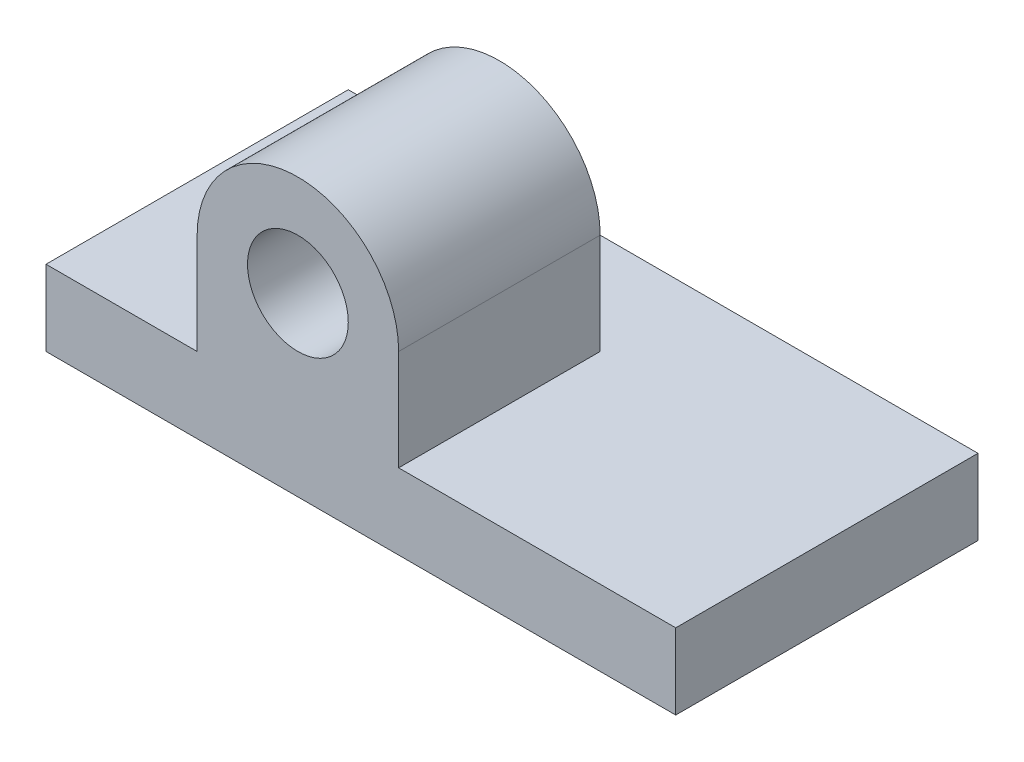
ISO-10303-21;
HEADER;
FILE_DESCRIPTION(('STEP AP214'),'2;1');
FILE_NAME('part.step','',(''),(''),'','','');
FILE_SCHEMA(('AUTOMOTIVE_DESIGN { 1 0 10303 214 1 1 1 1 }'));
ENDSEC;
DATA;
#1=APPLICATION_CONTEXT('core data for automotive mechanical design processes');
#2=APPLICATION_PROTOCOL_DEFINITION('international standard','automotive_design',2000,#1);
#3=PRODUCT_CONTEXT('',#1,'mechanical');
#4=PRODUCT('Part','Part','',(#3));
#5=PRODUCT_RELATED_PRODUCT_CATEGORY('part','',(#4));
#6=PRODUCT_DEFINITION_FORMATION('','',#4);
#7=PRODUCT_DEFINITION_CONTEXT('part definition',#1,'design');
#8=PRODUCT_DEFINITION('design','',#6,#7);
#9=PRODUCT_DEFINITION_SHAPE('','',#8);
#10=(LENGTH_UNIT() NAMED_UNIT(*) SI_UNIT(.MILLI.,.METRE.));
#11=(NAMED_UNIT(*) PLANE_ANGLE_UNIT() SI_UNIT($,.RADIAN.));
#12=(NAMED_UNIT(*) SI_UNIT($,.STERADIAN.) SOLID_ANGLE_UNIT());
#13=UNCERTAINTY_MEASURE_WITH_UNIT(LENGTH_MEASURE(1.E-05),#10,'distance_accuracy_value','');
#14=(GEOMETRIC_REPRESENTATION_CONTEXT(3) GLOBAL_UNCERTAINTY_ASSIGNED_CONTEXT((#13)) GLOBAL_UNIT_ASSIGNED_CONTEXT((#10,
#11,#12)) REPRESENTATION_CONTEXT('',''));
#15=CARTESIAN_POINT('',(0.,0.,0.));
#16=DIRECTION('',(0.,0.,1.));
#17=DIRECTION('',(1.,0.,0.));
#18=AXIS2_PLACEMENT_3D('',#15,#16,#17);
#19=CARTESIAN_POINT('',(30.,35.,-60.));
#20=DIRECTION('',(-1.,0.,0.));
#21=DIRECTION('',(0.,-1.,0.));
#22=AXIS2_PLACEMENT_3D('',#19,#20,#21);
#23=PLANE('',#22);
#24=DIRECTION('',(0.,0.,1.));
#25=VECTOR('',#24,1.);
#26=CARTESIAN_POINT('',(30.,35.,-60.));
#27=LINE('',#26,#25);
#28=CARTESIAN_POINT('',(30.,35.,-40.));
#29=VERTEX_POINT('',#28);
#30=CARTESIAN_POINT('',(30.,35.,0.));
#31=VERTEX_POINT('',#30);
#32=EDGE_CURVE('E143',#29,#31,#27,.T.);
#33=ORIENTED_EDGE('',*,*,#32,.F.);
#34=DIRECTION('',(0.,-1.,0.));
#35=VECTOR('',#34,1.);
#36=CARTESIAN_POINT('',(30.,35.,-40.));
#37=LINE('',#36,#35);
#38=CARTESIAN_POINT('',(30.,15.,-40.));
#39=VERTEX_POINT('',#38);
#40=EDGE_CURVE('E219',#29,#39,#37,.T.);
#41=ORIENTED_EDGE('',*,*,#40,.T.);
#42=DIRECTION('',(0.,0.,1.));
#43=VECTOR('',#42,1.);
#44=CARTESIAN_POINT('',(30.,15.,-60.));
#45=LINE('',#44,#43);
#46=CARTESIAN_POINT('',(30.,15.,0.));
#47=VERTEX_POINT('',#46);
#48=EDGE_CURVE('E54',#39,#47,#45,.T.);
#49=ORIENTED_EDGE('',*,*,#48,.T.);
#50=DIRECTION('',(0.,-1.,0.));
#51=VECTOR('',#50,1.);
#52=CARTESIAN_POINT('',(30.,35.,0.));
#53=LINE('',#52,#51);
#54=EDGE_CURVE('E184',#31,#47,#53,.T.);
#55=ORIENTED_EDGE('',*,*,#54,.F.);
#56=EDGE_LOOP('',(#33,#41,#49,#55));
#57=FACE_BOUND('',#56,.T.);
#58=ADVANCED_FACE('F44',(#57),#23,.T.);
#59=CARTESIAN_POINT('',(50.,35.,-60.));
#60=DIRECTION('',(0.,0.,1.));
#61=DIRECTION('',(1.,0.,0.));
#62=AXIS2_PLACEMENT_3D('',#59,#60,#61);
#63=CYLINDRICAL_SURFACE('',#62,20.);
#64=DIRECTION('',(0.,0.,1.));
#65=VECTOR('',#64,1.);
#66=CARTESIAN_POINT('',(70.,35.,-60.));
#67=LINE('',#66,#65);
#68=CARTESIAN_POINT('',(70.,35.,-40.));
#69=VERTEX_POINT('',#68);
#70=CARTESIAN_POINT('',(70.,35.,0.));
#71=VERTEX_POINT('',#70);
#72=EDGE_CURVE('E137',#69,#71,#67,.T.);
#73=ORIENTED_EDGE('',*,*,#72,.F.);
#74=CARTESIAN_POINT('',(50.,35.,-40.));
#75=DIRECTION('',(0.,0.,-1.));
#76=DIRECTION('',(-1.,0.,0.));
#77=AXIS2_PLACEMENT_3D('',#74,#75,#76);
#78=CIRCLE('',#77,20.);
#79=EDGE_CURVE('E61',#69,#29,#78,.F.);
#80=ORIENTED_EDGE('',*,*,#79,.T.);
#81=ORIENTED_EDGE('',*,*,#32,.T.);
#82=CARTESIAN_POINT('',(50.,35.,0.));
#83=DIRECTION('',(0.,0.,1.));
#84=DIRECTION('',(1.,0.,0.));
#85=AXIS2_PLACEMENT_3D('',#82,#83,#84);
#86=CIRCLE('',#85,20.);
#87=EDGE_CURVE('E181',#71,#31,#86,.T.);
#88=ORIENTED_EDGE('',*,*,#87,.F.);
#89=EDGE_LOOP('',(#73,#80,#81,#88));
#90=FACE_BOUND('',#89,.T.);
#91=ADVANCED_FACE('F199',(#90),#63,.T.);
#92=CARTESIAN_POINT('',(70.,35.,-60.));
#93=DIRECTION('',(1.,0.,0.));
#94=DIRECTION('',(0.,0.,-1.));
#95=AXIS2_PLACEMENT_3D('',#92,#93,#94);
#96=PLANE('',#95);
#97=DIRECTION('',(0.,0.,1.));
#98=VECTOR('',#97,1.);
#99=CARTESIAN_POINT('',(70.,15.,-60.));
#100=LINE('',#99,#98);
#101=CARTESIAN_POINT('',(70.,15.,-40.));
#102=VERTEX_POINT('',#101);
#103=CARTESIAN_POINT('',(70.,15.,0.));
#104=VERTEX_POINT('',#103);
#105=EDGE_CURVE('E127',#102,#104,#100,.T.);
#106=ORIENTED_EDGE('',*,*,#105,.F.);
#107=DIRECTION('',(0.,1.,0.));
#108=VECTOR('',#107,1.);
#109=CARTESIAN_POINT('',(70.,35.,-40.));
#110=LINE('',#109,#108);
#111=EDGE_CURVE('E118',#102,#69,#110,.T.);
#112=ORIENTED_EDGE('',*,*,#111,.T.);
#113=ORIENTED_EDGE('',*,*,#72,.T.);
#114=DIRECTION('',(0.,1.,0.));
#115=VECTOR('',#114,1.);
#116=CARTESIAN_POINT('',(70.,35.,0.));
#117=LINE('',#116,#115);
#118=EDGE_CURVE('E136',#104,#71,#117,.T.);
#119=ORIENTED_EDGE('',*,*,#118,.F.);
#120=EDGE_LOOP('',(#106,#112,#113,#119));
#121=FACE_BOUND('',#120,.T.);
#122=ADVANCED_FACE('F132',(#121),#96,.T.);
#123=CARTESIAN_POINT('',(50.,35.,-60.));
#124=DIRECTION('',(0.,0.,1.));
#125=DIRECTION('',(1.,0.,0.));
#126=AXIS2_PLACEMENT_3D('',#123,#124,#125);
#127=PLANE('',#126);
#128=DIRECTION('',(0.,-1.,0.));
#129=VECTOR('',#128,1.);
#130=CARTESIAN_POINT('',(0.,0.,-60.));
#131=LINE('',#130,#129);
#132=CARTESIAN_POINT('',(0.,15.,-60.));
#133=VERTEX_POINT('',#132);
#134=CARTESIAN_POINT('',(0.,0.,-60.));
#135=VERTEX_POINT('',#134);
#136=EDGE_CURVE('E195',#133,#135,#131,.T.);
#137=ORIENTED_EDGE('',*,*,#136,.F.);
#138=DIRECTION('',(-1.,0.,0.));
#139=VECTOR('',#138,1.);
#140=CARTESIAN_POINT('',(70.,15.,-60.));
#141=LINE('',#140,#139);
#142=CARTESIAN_POINT('',(125.,15.,-60.));
#143=VERTEX_POINT('',#142);
#144=EDGE_CURVE('E73',#143,#133,#141,.T.);
#145=ORIENTED_EDGE('',*,*,#144,.F.);
#146=DIRECTION('',(0.,1.,0.));
#147=VECTOR('',#146,1.);
#148=CARTESIAN_POINT('',(125.,0.,-60.));
#149=LINE('',#148,#147);
#150=CARTESIAN_POINT('',(125.,0.,-60.));
#151=VERTEX_POINT('',#150);
#152=EDGE_CURVE('E154',#151,#143,#149,.T.);
#153=ORIENTED_EDGE('',*,*,#152,.F.);
#154=DIRECTION('',(1.,0.,0.));
#155=VECTOR('',#154,1.);
#156=CARTESIAN_POINT('',(0.,0.,-60.));
#157=LINE('',#156,#155);
#158=EDGE_CURVE('E159',#135,#151,#157,.T.);
#159=ORIENTED_EDGE('',*,*,#158,.F.);
#160=EDGE_LOOP('',(#137,#145,#153,#159));
#161=FACE_BOUND('',#160,.T.);
#162=ADVANCED_FACE('F207',(#161),#127,.F.);
#163=CARTESIAN_POINT('',(50.,35.,-60.));
#164=DIRECTION('',(0.,0.,1.));
#165=DIRECTION('',(1.,0.,0.));
#166=AXIS2_PLACEMENT_3D('',#163,#164,#165);
#167=CYLINDRICAL_SURFACE('',#166,10.);
#168=CARTESIAN_POINT('',(50.,35.,0.));
#169=DIRECTION('',(0.,0.,1.));
#170=DIRECTION('',(1.,0.,0.));
#171=AXIS2_PLACEMENT_3D('',#168,#169,#170);
#172=CIRCLE('',#171,10.);
#173=CARTESIAN_POINT('',(60.,35.,0.));
#174=VERTEX_POINT('',#173);
#175=EDGE_CURVE('E166',#174,#174,#172,.T.);
#176=ORIENTED_EDGE('',*,*,#175,.T.);
#177=EDGE_LOOP('',(#176));
#178=FACE_BOUND('',#177,.T.);
#179=CARTESIAN_POINT('',(50.,35.,-40.));
#180=DIRECTION('',(0.,0.,-1.));
#181=DIRECTION('',(-1.,0.,0.));
#182=AXIS2_PLACEMENT_3D('',#179,#180,#181);
#183=CIRCLE('',#182,10.);
#184=CARTESIAN_POINT('',(40.,35.,-40.));
#185=VERTEX_POINT('',#184);
#186=EDGE_CURVE('E47',#185,#185,#183,.F.);
#187=ORIENTED_EDGE('',*,*,#186,.F.);
#188=EDGE_LOOP('',(#187));
#189=FACE_BOUND('',#188,.T.);
#190=ADVANCED_FACE('F230',(#178,#189),#167,.F.);
#191=CARTESIAN_POINT('',(0.,0.,-60.));
#192=DIRECTION('',(-1.,0.,0.));
#193=DIRECTION('',(0.,0.,1.));
#194=AXIS2_PLACEMENT_3D('',#191,#192,#193);
#195=PLANE('',#194);
#196=DIRECTION('',(0.,-1.,0.));
#197=VECTOR('',#196,1.);
#198=CARTESIAN_POINT('',(0.,0.,0.));
#199=LINE('',#198,#197);
#200=CARTESIAN_POINT('',(0.,15.,0.));
#201=VERTEX_POINT('',#200);
#202=CARTESIAN_POINT('',(0.,0.,0.));
#203=VERTEX_POINT('',#202);
#204=EDGE_CURVE('E161',#201,#203,#199,.T.);
#205=ORIENTED_EDGE('',*,*,#204,.F.);
#206=DIRECTION('',(0.,0.,1.));
#207=VECTOR('',#206,1.);
#208=CARTESIAN_POINT('',(0.,15.,-60.));
#209=LINE('',#208,#207);
#210=EDGE_CURVE('E11',#133,#201,#209,.T.);
#211=ORIENTED_EDGE('',*,*,#210,.F.);
#212=ORIENTED_EDGE('',*,*,#136,.T.);
#213=DIRECTION('',(0.,0.,1.));
#214=VECTOR('',#213,1.);
#215=CARTESIAN_POINT('',(0.,0.,-60.));
#216=LINE('',#215,#214);
#217=EDGE_CURVE('E110',#135,#203,#216,.T.);
#218=ORIENTED_EDGE('',*,*,#217,.T.);
#219=EDGE_LOOP('',(#205,#211,#212,#218));
#220=FACE_BOUND('',#219,.T.);
#221=ADVANCED_FACE('F50',(#220),#195,.T.);
#222=CARTESIAN_POINT('',(0.,15.,-60.));
#223=DIRECTION('',(0.,1.,0.));
#224=DIRECTION('',(0.,0.,1.));
#225=AXIS2_PLACEMENT_3D('',#222,#223,#224);
#226=PLANE('',#225);
#227=ORIENTED_EDGE('',*,*,#210,.T.);
#228=DIRECTION('',(-1.,0.,0.));
#229=VECTOR('',#228,1.);
#230=CARTESIAN_POINT('',(0.,15.,0.));
#231=LINE('',#230,#229);
#232=EDGE_CURVE('E188',#47,#201,#231,.T.);
#233=ORIENTED_EDGE('',*,*,#232,.F.);
#234=ORIENTED_EDGE('',*,*,#48,.F.);
#235=DIRECTION('',(-1.,0.,0.));
#236=VECTOR('',#235,1.);
#237=CARTESIAN_POINT('',(125.,15.,-40.));
#238=LINE('',#237,#236);
#239=EDGE_CURVE('E119',#102,#39,#238,.T.);
#240=ORIENTED_EDGE('',*,*,#239,.F.);
#241=ORIENTED_EDGE('',*,*,#105,.T.);
#242=DIRECTION('',(-1.,0.,0.));
#243=VECTOR('',#242,1.);
#244=CARTESIAN_POINT('',(70.,15.,0.));
#245=LINE('',#244,#243);
#246=CARTESIAN_POINT('',(125.,15.,0.));
#247=VERTEX_POINT('',#246);
#248=EDGE_CURVE('E176',#247,#104,#245,.T.);
#249=ORIENTED_EDGE('',*,*,#248,.F.);
#250=DIRECTION('',(0.,0.,1.));
#251=VECTOR('',#250,1.);
#252=CARTESIAN_POINT('',(125.,15.,-60.));
#253=LINE('',#252,#251);
#254=EDGE_CURVE('E139',#143,#247,#253,.T.);
#255=ORIENTED_EDGE('',*,*,#254,.F.);
#256=ORIENTED_EDGE('',*,*,#144,.T.);
#257=EDGE_LOOP('',(#227,#233,#234,#240,#241,#249,#255,#256));
#258=FACE_BOUND('',#257,.T.);
#259=ADVANCED_FACE('F126',(#258),#226,.T.);
#260=CARTESIAN_POINT('',(125.,0.,-60.));
#261=DIRECTION('',(1.,0.,0.));
#262=DIRECTION('',(0.,0.,-1.));
#263=AXIS2_PLACEMENT_3D('',#260,#261,#262);
#264=PLANE('',#263);
#265=DIRECTION('',(0.,1.,0.));
#266=VECTOR('',#265,1.);
#267=CARTESIAN_POINT('',(125.,0.,0.));
#268=LINE('',#267,#266);
#269=CARTESIAN_POINT('',(125.,0.,0.));
#270=VERTEX_POINT('',#269);
#271=EDGE_CURVE('E175',#270,#247,#268,.T.);
#272=ORIENTED_EDGE('',*,*,#271,.F.);
#273=DIRECTION('',(0.,0.,1.));
#274=VECTOR('',#273,1.);
#275=CARTESIAN_POINT('',(125.,0.,-60.));
#276=LINE('',#275,#274);
#277=EDGE_CURVE('E147',#151,#270,#276,.T.);
#278=ORIENTED_EDGE('',*,*,#277,.F.);
#279=ORIENTED_EDGE('',*,*,#152,.T.);
#280=ORIENTED_EDGE('',*,*,#254,.T.);
#281=EDGE_LOOP('',(#272,#278,#279,#280));
#282=FACE_BOUND('',#281,.T.);
#283=ADVANCED_FACE('F209',(#282),#264,.T.);
#284=CARTESIAN_POINT('',(0.,0.,-60.));
#285=DIRECTION('',(0.,-1.,0.));
#286=DIRECTION('',(0.,0.,-1.));
#287=AXIS2_PLACEMENT_3D('',#284,#285,#286);
#288=PLANE('',#287);
#289=DIRECTION('',(1.,0.,0.));
#290=VECTOR('',#289,1.);
#291=CARTESIAN_POINT('',(0.,0.,0.));
#292=LINE('',#291,#290);
#293=EDGE_CURVE('E167',#203,#270,#292,.T.);
#294=ORIENTED_EDGE('',*,*,#293,.F.);
#295=ORIENTED_EDGE('',*,*,#217,.F.);
#296=ORIENTED_EDGE('',*,*,#158,.T.);
#297=ORIENTED_EDGE('',*,*,#277,.T.);
#298=EDGE_LOOP('',(#294,#295,#296,#297));
#299=FACE_BOUND('',#298,.T.);
#300=ADVANCED_FACE('F213',(#299),#288,.T.);
#301=CARTESIAN_POINT('',(50.,35.,0.));
#302=DIRECTION('',(0.,0.,1.));
#303=DIRECTION('',(1.,0.,0.));
#304=AXIS2_PLACEMENT_3D('',#301,#302,#303);
#305=PLANE('',#304);
#306=ORIENTED_EDGE('',*,*,#175,.F.);
#307=EDGE_LOOP('',(#306));
#308=FACE_BOUND('',#307,.T.);
#309=ORIENTED_EDGE('',*,*,#204,.T.);
#310=ORIENTED_EDGE('',*,*,#293,.T.);
#311=ORIENTED_EDGE('',*,*,#271,.T.);
#312=ORIENTED_EDGE('',*,*,#248,.T.);
#313=ORIENTED_EDGE('',*,*,#118,.T.);
#314=ORIENTED_EDGE('',*,*,#87,.T.);
#315=ORIENTED_EDGE('',*,*,#54,.T.);
#316=ORIENTED_EDGE('',*,*,#232,.T.);
#317=EDGE_LOOP('',(#309,#310,#311,#312,#313,#314,#315,#316));
#318=FACE_BOUND('',#317,.T.);
#319=ADVANCED_FACE('F201',(#308,#318),#305,.T.);
#320=CARTESIAN_POINT('',(125.,15.,-40.));
#321=DIRECTION('',(0.,0.,-1.));
#322=DIRECTION('',(-1.,0.,0.));
#323=AXIS2_PLACEMENT_3D('',#320,#321,#322);
#324=PLANE('',#323);
#325=ORIENTED_EDGE('',*,*,#79,.F.);
#326=ORIENTED_EDGE('',*,*,#111,.F.);
#327=ORIENTED_EDGE('',*,*,#239,.T.);
#328=ORIENTED_EDGE('',*,*,#40,.F.);
#329=EDGE_LOOP('',(#325,#326,#327,#328));
#330=FACE_BOUND('',#329,.T.);
#331=ORIENTED_EDGE('',*,*,#186,.T.);
#332=EDGE_LOOP('',(#331));
#333=FACE_BOUND('',#332,.T.);
#334=ADVANCED_FACE('F116',(#330,#333),#324,.T.);
#335=CLOSED_SHELL('',(#58,#91,#122,#162,#190,#221,#259,#283,#300,#319,#334));
#336=MANIFOLD_SOLID_BREP('B2',#335);
#337=ADVANCED_BREP_SHAPE_REPRESENTATION('',(#18,#336),#14);
#338=SHAPE_DEFINITION_REPRESENTATION(#9,#337);
ENDSEC;
END-ISO-10303-21;
